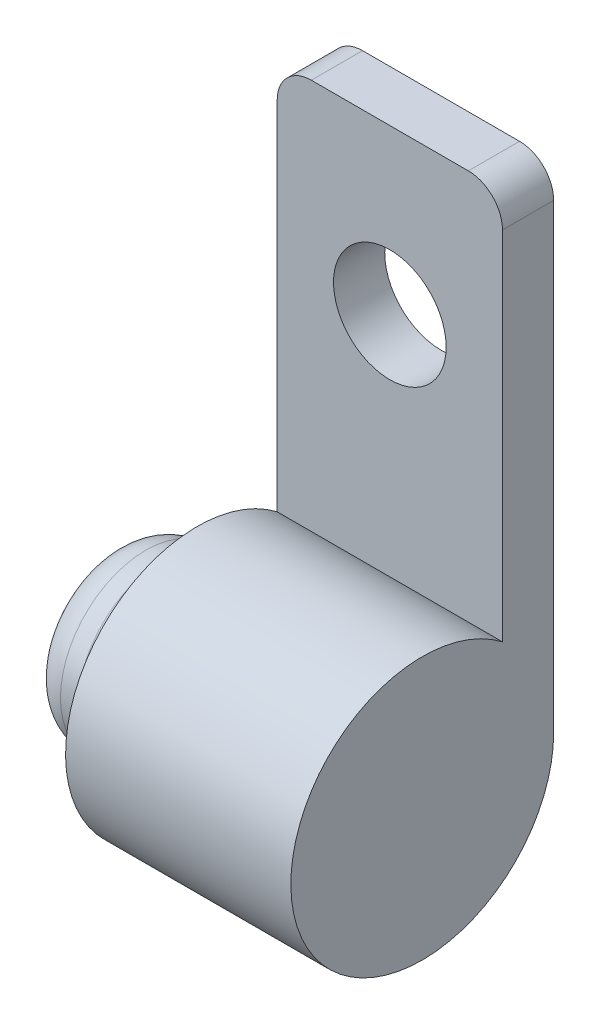
ISO-10303-21;
HEADER;
FILE_DESCRIPTION(('STEP AP214'),'2;1');
FILE_NAME('part.step','',(''),(''),'','','');
FILE_SCHEMA(('AUTOMOTIVE_DESIGN { 1 0 10303 214 1 1 1 1 }'));
ENDSEC;
DATA;
#1=APPLICATION_CONTEXT('core data for automotive mechanical design processes');
#2=APPLICATION_PROTOCOL_DEFINITION('international standard','automotive_design',2000,#1);
#3=PRODUCT_CONTEXT('',#1,'mechanical');
#4=PRODUCT('Part','Part','',(#3));
#5=PRODUCT_RELATED_PRODUCT_CATEGORY('part','',(#4));
#6=PRODUCT_DEFINITION_FORMATION('','',#4);
#7=PRODUCT_DEFINITION_CONTEXT('part definition',#1,'design');
#8=PRODUCT_DEFINITION('design','',#6,#7);
#9=PRODUCT_DEFINITION_SHAPE('','',#8);
#10=(LENGTH_UNIT() NAMED_UNIT(*) SI_UNIT(.MILLI.,.METRE.));
#11=(NAMED_UNIT(*) PLANE_ANGLE_UNIT() SI_UNIT($,.RADIAN.));
#12=(NAMED_UNIT(*) SI_UNIT($,.STERADIAN.) SOLID_ANGLE_UNIT());
#13=UNCERTAINTY_MEASURE_WITH_UNIT(LENGTH_MEASURE(1.E-05),#10,'distance_accuracy_value','');
#14=(GEOMETRIC_REPRESENTATION_CONTEXT(3) GLOBAL_UNCERTAINTY_ASSIGNED_CONTEXT((#13)) GLOBAL_UNIT_ASSIGNED_CONTEXT((#10,
#11,#12)) REPRESENTATION_CONTEXT('',''));
#15=CARTESIAN_POINT('',(0.,0.,0.));
#16=DIRECTION('',(0.,0.,1.));
#17=DIRECTION('',(1.,0.,0.));
#18=AXIS2_PLACEMENT_3D('',#15,#16,#17);
#19=CARTESIAN_POINT('',(6.6,0.,0.));
#20=DIRECTION('',(-1.,0.,0.));
#21=DIRECTION('',(0.,0.,1.));
#22=AXIS2_PLACEMENT_3D('',#19,#20,#21);
#23=CYLINDRICAL_SURFACE('',#22,3.85);
#24=CARTESIAN_POINT('',(6.6,0.,0.));
#25=DIRECTION('',(1.,0.,0.));
#26=DIRECTION('',(0.,0.,-1.));
#27=AXIS2_PLACEMENT_3D('',#24,#25,#26);
#28=CIRCLE('',#27,3.85);
#29=CARTESIAN_POINT('',(6.6,3.04959013639538,-2.35));
#30=VERTEX_POINT('',#29);
#31=CARTESIAN_POINT('',(6.6,0.,-3.85));
#32=VERTEX_POINT('',#31);
#33=EDGE_CURVE('E103',#30,#32,#28,.T.);
#34=ORIENTED_EDGE('',*,*,#33,.F.);
#35=DIRECTION('',(-1.,0.,0.));
#36=VECTOR('',#35,1.);
#37=CARTESIAN_POINT('',(21.1773797371133,3.04959013639538,-2.35));
#38=LINE('',#37,#36);
#39=CARTESIAN_POINT('',(0.,3.04959013639538,-2.35));
#40=VERTEX_POINT('',#39);
#41=EDGE_CURVE('E104',#30,#40,#38,.T.);
#42=ORIENTED_EDGE('',*,*,#41,.T.);
#43=CARTESIAN_POINT('',(0.,0.,0.));
#44=DIRECTION('',(1.,0.,0.));
#45=DIRECTION('',(0.,0.,-1.));
#46=AXIS2_PLACEMENT_3D('',#43,#44,#45);
#47=CIRCLE('',#46,3.85);
#48=CARTESIAN_POINT('',(0.,0.,-3.85));
#49=VERTEX_POINT('',#48);
#50=EDGE_CURVE('E93',#40,#49,#47,.T.);
#51=ORIENTED_EDGE('',*,*,#50,.T.);
#52=DIRECTION('',(-1.,0.,0.));
#53=VECTOR('',#52,1.);
#54=CARTESIAN_POINT('',(21.1773797371133,0.,-3.85));
#55=LINE('',#54,#53);
#56=EDGE_CURVE('E108',#32,#49,#55,.T.);
#57=ORIENTED_EDGE('',*,*,#56,.F.);
#58=EDGE_LOOP('',(#34,#42,#51,#57));
#59=FACE_BOUND('',#58,.T.);
#60=ADVANCED_FACE('F37',(#59),#23,.T.);
#61=CARTESIAN_POINT('',(6.6,0.,0.));
#62=DIRECTION('',(1.,0.,0.));
#63=DIRECTION('',(0.,0.,-1.));
#64=AXIS2_PLACEMENT_3D('',#61,#62,#63);
#65=PLANE('',#64);
#66=DIRECTION('',(0.,-1.,0.));
#67=VECTOR('',#66,1.);
#68=CARTESIAN_POINT('',(6.6,0.,-3.85));
#69=LINE('',#68,#67);
#70=CARTESIAN_POINT('',(6.6,13.5,-3.85));
#71=VERTEX_POINT('',#70);
#72=EDGE_CURVE('E121',#71,#32,#69,.T.);
#73=ORIENTED_EDGE('',*,*,#72,.F.);
#74=DIRECTION('',(0.,0.,-1.));
#75=VECTOR('',#74,1.);
#76=CARTESIAN_POINT('',(6.6,13.5,0.));
#77=LINE('',#76,#75);
#78=CARTESIAN_POINT('',(6.6,13.5,-2.35));
#79=VERTEX_POINT('',#78);
#80=EDGE_CURVE('E60',#71,#79,#77,.F.);
#81=ORIENTED_EDGE('',*,*,#80,.T.);
#82=DIRECTION('',(0.,1.,0.));
#83=VECTOR('',#82,1.);
#84=CARTESIAN_POINT('',(6.6,14.5,-2.35));
#85=LINE('',#84,#83);
#86=EDGE_CURVE('E113',#30,#79,#85,.T.);
#87=ORIENTED_EDGE('',*,*,#86,.F.);
#88=ORIENTED_EDGE('',*,*,#33,.T.);
#89=EDGE_LOOP('',(#73,#81,#87,#88));
#90=FACE_BOUND('',#89,.T.);
#91=ADVANCED_FACE('F162',(#90),#65,.T.);
#92=CARTESIAN_POINT('',(0.,0.,0.));
#93=DIRECTION('',(1.,0.,0.));
#94=DIRECTION('',(0.,0.,-1.));
#95=AXIS2_PLACEMENT_3D('',#92,#93,#94);
#96=PLANE('',#95);
#97=CARTESIAN_POINT('',(0.,0.,0.));
#98=DIRECTION('',(1.,0.,0.));
#99=DIRECTION('',(0.,0.,-1.));
#100=AXIS2_PLACEMENT_3D('',#97,#98,#99);
#101=CIRCLE('',#100,3.5);
#102=CARTESIAN_POINT('',(0.,0.,-3.5));
#103=VERTEX_POINT('',#102);
#104=EDGE_CURVE('E135',#103,#103,#101,.T.);
#105=ORIENTED_EDGE('',*,*,#104,.T.);
#106=EDGE_LOOP('',(#105));
#107=FACE_BOUND('',#106,.T.);
#108=DIRECTION('',(0.,1.,0.));
#109=VECTOR('',#108,1.);
#110=CARTESIAN_POINT('',(0.,14.5,-2.35));
#111=LINE('',#110,#109);
#112=CARTESIAN_POINT('',(0.,13.5,-2.35));
#113=VERTEX_POINT('',#112);
#114=EDGE_CURVE('E96',#40,#113,#111,.T.);
#115=ORIENTED_EDGE('',*,*,#114,.T.);
#116=DIRECTION('',(0.,0.,-1.));
#117=VECTOR('',#116,1.);
#118=CARTESIAN_POINT('',(0.,13.5,-3.85));
#119=LINE('',#118,#117);
#120=CARTESIAN_POINT('',(0.,13.5,-3.85));
#121=VERTEX_POINT('',#120);
#122=EDGE_CURVE('E12',#113,#121,#119,.T.);
#123=ORIENTED_EDGE('',*,*,#122,.T.);
#124=DIRECTION('',(0.,-1.,0.));
#125=VECTOR('',#124,1.);
#126=CARTESIAN_POINT('',(0.,0.,-3.85));
#127=LINE('',#126,#125);
#128=EDGE_CURVE('E99',#121,#49,#127,.T.);
#129=ORIENTED_EDGE('',*,*,#128,.T.);
#130=ORIENTED_EDGE('',*,*,#50,.F.);
#131=EDGE_LOOP('',(#115,#123,#129,#130));
#132=FACE_BOUND('',#131,.T.);
#133=ADVANCED_FACE('F95',(#107,#132),#96,.F.);
#134=CARTESIAN_POINT('',(21.1773797371133,14.5,-2.35));
#135=DIRECTION('',(0.,0.,1.));
#136=DIRECTION('',(0.,-1.,0.));
#137=AXIS2_PLACEMENT_3D('',#134,#135,#136);
#138=PLANE('',#137);
#139=CARTESIAN_POINT('',(3.3,9.7,-2.35));
#140=DIRECTION('',(0.,0.,1.));
#141=DIRECTION('',(1.,0.,0.));
#142=AXIS2_PLACEMENT_3D('',#139,#140,#141);
#143=CIRCLE('',#142,1.65);
#144=CARTESIAN_POINT('',(4.95,9.7,-2.35));
#145=VERTEX_POINT('',#144);
#146=EDGE_CURVE('E116',#145,#145,#143,.T.);
#147=ORIENTED_EDGE('',*,*,#146,.F.);
#148=EDGE_LOOP('',(#147));
#149=FACE_BOUND('',#148,.T.);
#150=ORIENTED_EDGE('',*,*,#86,.T.);
#151=CARTESIAN_POINT('',(5.6,13.5,-2.35));
#152=DIRECTION('',(0.,0.,1.));
#153=DIRECTION('',(0.,-1.,0.));
#154=AXIS2_PLACEMENT_3D('',#151,#152,#153);
#155=CIRCLE('',#154,1.);
#156=CARTESIAN_POINT('',(5.6,14.5,-2.35));
#157=VERTEX_POINT('',#156);
#158=EDGE_CURVE('E45',#79,#157,#155,.T.);
#159=ORIENTED_EDGE('',*,*,#158,.T.);
#160=DIRECTION('',(-1.,0.,0.));
#161=VECTOR('',#160,1.);
#162=CARTESIAN_POINT('',(21.1773797371133,14.5,-2.35));
#163=LINE('',#162,#161);
#164=CARTESIAN_POINT('',(1.,14.5,-2.35));
#165=VERTEX_POINT('',#164);
#166=EDGE_CURVE('E120',#157,#165,#163,.T.);
#167=ORIENTED_EDGE('',*,*,#166,.T.);
#168=CARTESIAN_POINT('',(1.,13.5,-2.35));
#169=DIRECTION('',(0.,0.,1.));
#170=DIRECTION('',(0.,-1.,0.));
#171=AXIS2_PLACEMENT_3D('',#168,#169,#170);
#172=CIRCLE('',#171,1.);
#173=EDGE_CURVE('E52',#165,#113,#172,.T.);
#174=ORIENTED_EDGE('',*,*,#173,.T.);
#175=ORIENTED_EDGE('',*,*,#114,.F.);
#176=ORIENTED_EDGE('',*,*,#41,.F.);
#177=EDGE_LOOP('',(#150,#159,#167,#174,#175,#176));
#178=FACE_BOUND('',#177,.T.);
#179=ADVANCED_FACE('F110',(#149,#178),#138,.T.);
#180=CARTESIAN_POINT('',(21.1773797371133,14.5,-3.85));
#181=DIRECTION('',(0.,1.,0.));
#182=DIRECTION('',(0.,0.,1.));
#183=AXIS2_PLACEMENT_3D('',#180,#181,#182);
#184=PLANE('',#183);
#185=ORIENTED_EDGE('',*,*,#166,.F.);
#186=DIRECTION('',(0.,0.,-1.));
#187=VECTOR('',#186,1.);
#188=CARTESIAN_POINT('',(5.6,14.5,-3.85));
#189=LINE('',#188,#187);
#190=CARTESIAN_POINT('',(5.6,14.5,-3.85));
#191=VERTEX_POINT('',#190);
#192=EDGE_CURVE('E143',#157,#191,#189,.T.);
#193=ORIENTED_EDGE('',*,*,#192,.T.);
#194=DIRECTION('',(-1.,0.,0.));
#195=VECTOR('',#194,1.);
#196=CARTESIAN_POINT('',(21.1773797371133,14.5,-3.85));
#197=LINE('',#196,#195);
#198=CARTESIAN_POINT('',(1.,14.5,-3.85));
#199=VERTEX_POINT('',#198);
#200=EDGE_CURVE('E123',#191,#199,#197,.T.);
#201=ORIENTED_EDGE('',*,*,#200,.T.);
#202=DIRECTION('',(0.,0.,-1.));
#203=VECTOR('',#202,1.);
#204=CARTESIAN_POINT('',(1.,14.5,-2.35));
#205=LINE('',#204,#203);
#206=EDGE_CURVE('E141',#199,#165,#205,.F.);
#207=ORIENTED_EDGE('',*,*,#206,.T.);
#208=EDGE_LOOP('',(#185,#193,#201,#207));
#209=FACE_BOUND('',#208,.T.);
#210=ADVANCED_FACE('F156',(#209),#184,.T.);
#211=CARTESIAN_POINT('',(21.1773797371133,0.,-3.85));
#212=DIRECTION('',(0.,0.,-1.));
#213=DIRECTION('',(-1.,0.,0.));
#214=AXIS2_PLACEMENT_3D('',#211,#212,#213);
#215=PLANE('',#214);
#216=CARTESIAN_POINT('',(3.3,9.7,-3.85));
#217=DIRECTION('',(0.,0.,-1.));
#218=DIRECTION('',(-1.,0.,0.));
#219=AXIS2_PLACEMENT_3D('',#216,#217,#218);
#220=CIRCLE('',#219,1.65);
#221=CARTESIAN_POINT('',(1.65,9.7,-3.85));
#222=VERTEX_POINT('',#221);
#223=EDGE_CURVE('E111',#222,#222,#220,.F.);
#224=ORIENTED_EDGE('',*,*,#223,.T.);
#225=EDGE_LOOP('',(#224));
#226=FACE_BOUND('',#225,.T.);
#227=ORIENTED_EDGE('',*,*,#200,.F.);
#228=CARTESIAN_POINT('',(5.6,13.5,-3.85));
#229=DIRECTION('',(0.,0.,-1.));
#230=DIRECTION('',(-1.,0.,0.));
#231=AXIS2_PLACEMENT_3D('',#228,#229,#230);
#232=CIRCLE('',#231,1.);
#233=EDGE_CURVE('E148',#191,#71,#232,.T.);
#234=ORIENTED_EDGE('',*,*,#233,.T.);
#235=ORIENTED_EDGE('',*,*,#72,.T.);
#236=ORIENTED_EDGE('',*,*,#56,.T.);
#237=ORIENTED_EDGE('',*,*,#128,.F.);
#238=CARTESIAN_POINT('',(1.,13.5,-3.85));
#239=DIRECTION('',(0.,0.,-1.));
#240=DIRECTION('',(-1.,0.,0.));
#241=AXIS2_PLACEMENT_3D('',#238,#239,#240);
#242=CIRCLE('',#241,1.);
#243=EDGE_CURVE('E146',#121,#199,#242,.T.);
#244=ORIENTED_EDGE('',*,*,#243,.T.);
#245=EDGE_LOOP('',(#227,#234,#235,#236,#237,#244));
#246=FACE_BOUND('',#245,.T.);
#247=ADVANCED_FACE('F161',(#226,#246),#215,.T.);
#248=CARTESIAN_POINT('',(3.3,9.7,-8.51690475583121));
#249=DIRECTION('',(0.,0.,1.));
#250=DIRECTION('',(1.,0.,0.));
#251=AXIS2_PLACEMENT_3D('',#248,#249,#250);
#252=CYLINDRICAL_SURFACE('',#251,1.65);
#253=ORIENTED_EDGE('',*,*,#146,.T.);
#254=EDGE_LOOP('',(#253));
#255=FACE_BOUND('',#254,.T.);
#256=ORIENTED_EDGE('',*,*,#223,.F.);
#257=EDGE_LOOP('',(#256));
#258=FACE_BOUND('',#257,.T.);
#259=ADVANCED_FACE('F204',(#255,#258),#252,.F.);
#260=CARTESIAN_POINT('',(-18.6710678118655,0.,0.));
#261=DIRECTION('',(1.,0.,0.));
#262=DIRECTION('',(0.,0.,-1.));
#263=AXIS2_PLACEMENT_3D('',#260,#261,#262);
#264=CYLINDRICAL_SURFACE('',#263,2.5);
#265=CARTESIAN_POINT('',(-1.,0.,0.));
#266=DIRECTION('',(1.,0.,0.));
#267=DIRECTION('',(0.,0.,-1.));
#268=AXIS2_PLACEMENT_3D('',#265,#266,#267);
#269=CIRCLE('',#268,2.5);
#270=CARTESIAN_POINT('',(-1.,0.,-2.5));
#271=VERTEX_POINT('',#270);
#272=EDGE_CURVE('E132',#271,#271,#269,.F.);
#273=ORIENTED_EDGE('',*,*,#272,.T.);
#274=EDGE_LOOP('',(#273));
#275=FACE_BOUND('',#274,.T.);
#276=CARTESIAN_POINT('',(-1.5,0.,0.));
#277=DIRECTION('',(1.,0.,0.));
#278=DIRECTION('',(0.,0.,-1.));
#279=AXIS2_PLACEMENT_3D('',#276,#277,#278);
#280=CIRCLE('',#279,2.5);
#281=CARTESIAN_POINT('',(-1.5,0.,-2.5));
#282=VERTEX_POINT('',#281);
#283=EDGE_CURVE('E128',#282,#282,#280,.T.);
#284=ORIENTED_EDGE('',*,*,#283,.T.);
#285=EDGE_LOOP('',(#284));
#286=FACE_BOUND('',#285,.T.);
#287=ADVANCED_FACE('F254',(#275,#286),#264,.T.);
#288=CARTESIAN_POINT('',(-2.5,0.,0.));
#289=DIRECTION('',(1.,0.,0.));
#290=DIRECTION('',(0.,0.,-1.));
#291=AXIS2_PLACEMENT_3D('',#288,#289,#290);
#292=PLANE('',#291);
#293=CARTESIAN_POINT('',(-2.5,0.,0.));
#294=DIRECTION('',(1.,0.,0.));
#295=DIRECTION('',(0.,0.,-1.));
#296=AXIS2_PLACEMENT_3D('',#293,#294,#295);
#297=CIRCLE('',#296,1.5);
#298=CARTESIAN_POINT('',(-2.5,0.,-1.5));
#299=VERTEX_POINT('',#298);
#300=EDGE_CURVE('E138',#299,#299,#297,.F.);
#301=ORIENTED_EDGE('',*,*,#300,.T.);
#302=EDGE_LOOP('',(#301));
#303=FACE_BOUND('',#302,.T.);
#304=ADVANCED_FACE('F179',(#303),#292,.F.);
#305=CARTESIAN_POINT('',(-1.,0.,0.));
#306=DIRECTION('',(1.,0.,0.));
#307=DIRECTION('',(0.,0.,-1.));
#308=AXIS2_PLACEMENT_3D('',#305,#306,#307);
#309=TOROIDAL_SURFACE('',#308,3.5,1.);
#310=ORIENTED_EDGE('',*,*,#104,.F.);
#311=EDGE_LOOP('',(#310));
#312=FACE_BOUND('',#311,.T.);
#313=ORIENTED_EDGE('',*,*,#272,.F.);
#314=EDGE_LOOP('',(#313));
#315=FACE_BOUND('',#314,.T.);
#316=ADVANCED_FACE('F175',(#312,#315),#309,.F.);
#317=CARTESIAN_POINT('',(-1.5,0.,0.));
#318=DIRECTION('',(1.,0.,0.));
#319=DIRECTION('',(0.,0.,-1.));
#320=AXIS2_PLACEMENT_3D('',#317,#318,#319);
#321=TOROIDAL_SURFACE('',#320,1.5,1.);
#322=ORIENTED_EDGE('',*,*,#300,.F.);
#323=EDGE_LOOP('',(#322));
#324=FACE_BOUND('',#323,.T.);
#325=ORIENTED_EDGE('',*,*,#283,.F.);
#326=EDGE_LOOP('',(#325));
#327=FACE_BOUND('',#326,.T.);
#328=ADVANCED_FACE('F178',(#324,#327),#321,.T.);
#329=CARTESIAN_POINT('',(5.6,13.5,-3.85));
#330=DIRECTION('',(0.,0.,-1.));
#331=DIRECTION('',(0.,1.,0.));
#332=AXIS2_PLACEMENT_3D('',#329,#330,#331);
#333=CYLINDRICAL_SURFACE('',#332,1.);
#334=ORIENTED_EDGE('',*,*,#158,.F.);
#335=ORIENTED_EDGE('',*,*,#80,.F.);
#336=ORIENTED_EDGE('',*,*,#233,.F.);
#337=ORIENTED_EDGE('',*,*,#192,.F.);
#338=EDGE_LOOP('',(#334,#335,#336,#337));
#339=FACE_BOUND('',#338,.T.);
#340=ADVANCED_FACE('F159',(#339),#333,.T.);
#341=CARTESIAN_POINT('',(1.,13.5,0.));
#342=DIRECTION('',(0.,0.,1.));
#343=DIRECTION('',(0.,-1.,0.));
#344=AXIS2_PLACEMENT_3D('',#341,#342,#343);
#345=CYLINDRICAL_SURFACE('',#344,1.);
#346=ORIENTED_EDGE('',*,*,#173,.F.);
#347=ORIENTED_EDGE('',*,*,#206,.F.);
#348=ORIENTED_EDGE('',*,*,#243,.F.);
#349=ORIENTED_EDGE('',*,*,#122,.F.);
#350=EDGE_LOOP('',(#346,#347,#348,#349));
#351=FACE_BOUND('',#350,.T.);
#352=ADVANCED_FACE('F39',(#351),#345,.T.);
#353=CLOSED_SHELL('',(#60,#91,#133,#179,#210,#247,#259,#287,#304,#316,#328,#340,#352));
#354=MANIFOLD_SOLID_BREP('B2',#353);
#355=ADVANCED_BREP_SHAPE_REPRESENTATION('',(#18,#354),#14);
#356=SHAPE_DEFINITION_REPRESENTATION(#9,#355);
ENDSEC;
END-ISO-10303-21;
